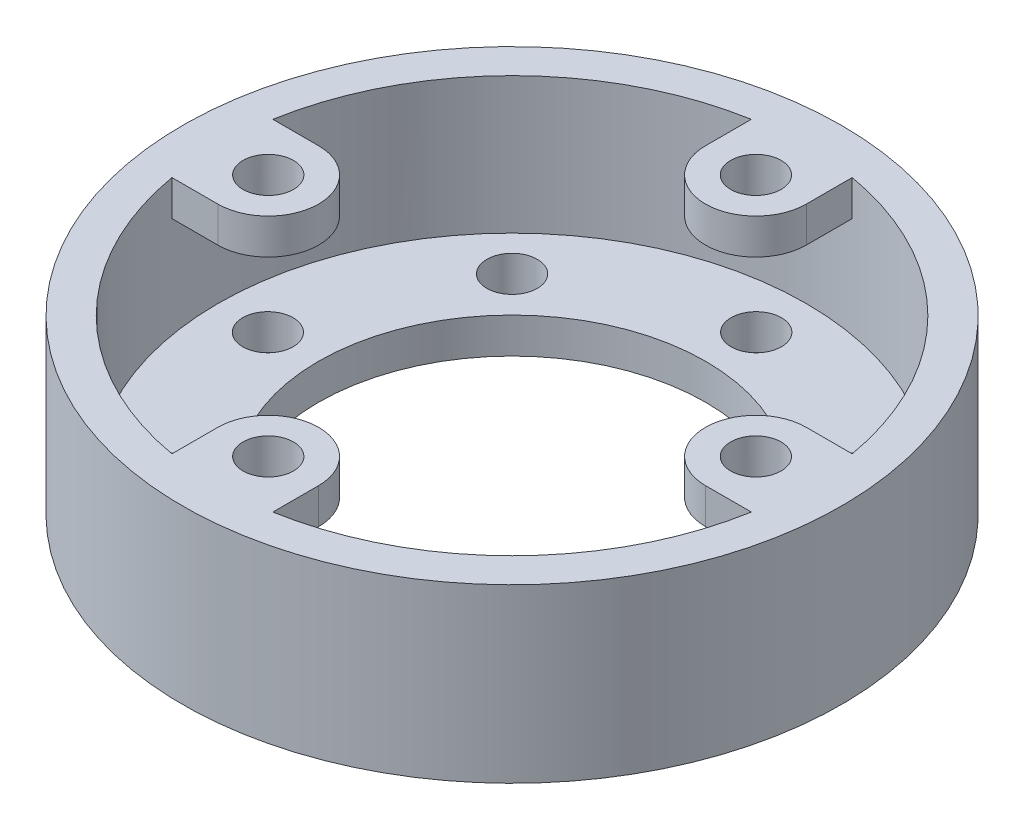
ISO-10303-21;
HEADER;
FILE_DESCRIPTION(('STEP AP214'),'2;1');
FILE_NAME('part.step','',(''),(''),'','','');
FILE_SCHEMA(('AUTOMOTIVE_DESIGN { 1 0 10303 214 1 1 1 1 }'));
ENDSEC;
DATA;
#1=APPLICATION_CONTEXT('core data for automotive mechanical design processes');
#2=APPLICATION_PROTOCOL_DEFINITION('international standard','automotive_design',2000,#1);
#3=PRODUCT_CONTEXT('',#1,'mechanical');
#4=PRODUCT('Part','Part','',(#3));
#5=PRODUCT_RELATED_PRODUCT_CATEGORY('part','',(#4));
#6=PRODUCT_DEFINITION_FORMATION('','',#4);
#7=PRODUCT_DEFINITION_CONTEXT('part definition',#1,'design');
#8=PRODUCT_DEFINITION('design','',#6,#7);
#9=PRODUCT_DEFINITION_SHAPE('','',#8);
#10=(LENGTH_UNIT() NAMED_UNIT(*) SI_UNIT(.MILLI.,.METRE.));
#11=(NAMED_UNIT(*) PLANE_ANGLE_UNIT() SI_UNIT($,.RADIAN.));
#12=(NAMED_UNIT(*) SI_UNIT($,.STERADIAN.) SOLID_ANGLE_UNIT());
#13=UNCERTAINTY_MEASURE_WITH_UNIT(LENGTH_MEASURE(1.E-05),#10,'distance_accuracy_value','');
#14=(GEOMETRIC_REPRESENTATION_CONTEXT(3) GLOBAL_UNCERTAINTY_ASSIGNED_CONTEXT((#13)) GLOBAL_UNIT_ASSIGNED_CONTEXT((#10,
#11,#12)) REPRESENTATION_CONTEXT('',''));
#15=CARTESIAN_POINT('',(0.,0.,0.));
#16=DIRECTION('',(0.,0.,1.));
#17=DIRECTION('',(1.,0.,0.));
#18=AXIS2_PLACEMENT_3D('',#15,#16,#17);
#19=CARTESIAN_POINT('',(0.,0.,0.));
#20=DIRECTION('',(0.,-1.,0.));
#21=DIRECTION('',(0.,0.,-1.));
#22=AXIS2_PLACEMENT_3D('',#19,#20,#21);
#23=CYLINDRICAL_SURFACE('',#22,2565.);
#24=CARTESIAN_POINT('',(0.,310.,0.));
#25=DIRECTION('',(0.,-1.,0.));
#26=DIRECTION('',(0.,0.,-1.));
#27=AXIS2_PLACEMENT_3D('',#24,#25,#26);
#28=CIRCLE('',#27,2565.);
#29=CARTESIAN_POINT('',(0.,310.,-2565.));
#30=VERTEX_POINT('',#29);
#31=EDGE_CURVE('E370',#30,#30,#28,.T.);
#32=ORIENTED_EDGE('',*,*,#31,.T.);
#33=EDGE_LOOP('',(#32));
#34=FACE_BOUND('',#33,.T.);
#35=DIRECTION('',(0.,1.,0.));
#36=VECTOR('',#35,1.);
#37=CARTESIAN_POINT('',(-2526.97942215602,1190.,-440.000000000026));
#38=LINE('',#37,#36);
#39=CARTESIAN_POINT('',(-2526.97942215602,1190.,-440.000000000026));
#40=VERTEX_POINT('',#39);
#41=CARTESIAN_POINT('',(-2526.97942215602,1500.,-440.000000000026));
#42=VERTEX_POINT('',#41);
#43=EDGE_CURVE('E55',#40,#42,#38,.T.);
#44=ORIENTED_EDGE('',*,*,#43,.F.);
#45=CARTESIAN_POINT('',(6.52811138479592E-11,1190.,0.));
#46=DIRECTION('',(0.,-1.,0.));
#47=DIRECTION('',(-1.,0.,0.));
#48=AXIS2_PLACEMENT_3D('',#45,#46,#47);
#49=CIRCLE('',#48,2565.00000000006);
#50=CARTESIAN_POINT('',(-2526.97942215603,1190.,439.999999999974));
#51=VERTEX_POINT('',#50);
#52=EDGE_CURVE('E162',#51,#40,#49,.T.);
#53=ORIENTED_EDGE('',*,*,#52,.F.);
#54=DIRECTION('',(0.,1.,0.));
#55=VECTOR('',#54,1.);
#56=CARTESIAN_POINT('',(-2526.97942215603,1190.,439.999999999974));
#57=LINE('',#56,#55);
#58=CARTESIAN_POINT('',(-2526.97942215603,1500.,439.999999999974));
#59=VERTEX_POINT('',#58);
#60=EDGE_CURVE('E782',#51,#59,#57,.T.);
#61=ORIENTED_EDGE('',*,*,#60,.T.);
#62=CARTESIAN_POINT('',(0.,1500.,0.));
#63=DIRECTION('',(0.,-1.,0.));
#64=DIRECTION('',(0.,0.,-1.));
#65=AXIS2_PLACEMENT_3D('',#62,#63,#64);
#66=CIRCLE('',#65,2565.);
#67=CARTESIAN_POINT('',(-440.,1500.,2526.97942215603));
#68=VERTEX_POINT('',#67);
#69=EDGE_CURVE('E468',#68,#59,#66,.T.);
#70=ORIENTED_EDGE('',*,*,#69,.F.);
#71=DIRECTION('',(0.,1.,0.));
#72=VECTOR('',#71,1.);
#73=CARTESIAN_POINT('',(-440.,1190.,2526.97942215603));
#74=LINE('',#73,#72);
#75=CARTESIAN_POINT('',(-440.,1190.,2526.97942215603));
#76=VERTEX_POINT('',#75);
#77=EDGE_CURVE('E63',#76,#68,#74,.T.);
#78=ORIENTED_EDGE('',*,*,#77,.F.);
#79=CARTESIAN_POINT('',(0.,1190.,-6.52811138479592E-11));
#80=DIRECTION('',(0.,-1.,0.));
#81=DIRECTION('',(0.,0.,1.));
#82=AXIS2_PLACEMENT_3D('',#79,#80,#81);
#83=CIRCLE('',#82,2565.00000000006);
#84=CARTESIAN_POINT('',(440.,1190.,2526.97942215603));
#85=VERTEX_POINT('',#84);
#86=EDGE_CURVE('E188',#85,#76,#83,.T.);
#87=ORIENTED_EDGE('',*,*,#86,.F.);
#88=DIRECTION('',(0.,1.,0.));
#89=VECTOR('',#88,1.);
#90=CARTESIAN_POINT('',(440.,1190.,2526.97942215603));
#91=LINE('',#90,#89);
#92=CARTESIAN_POINT('',(440.,1500.,2526.97942215603));
#93=VERTEX_POINT('',#92);
#94=EDGE_CURVE('E203',#85,#93,#91,.T.);
#95=ORIENTED_EDGE('',*,*,#94,.T.);
#96=CARTESIAN_POINT('',(2526.97942215602,1500.,440.000000000009));
#97=VERTEX_POINT('',#96);
#98=EDGE_CURVE('E382',#97,#93,#66,.T.);
#99=ORIENTED_EDGE('',*,*,#98,.F.);
#100=DIRECTION('',(0.,1.,0.));
#101=VECTOR('',#100,1.);
#102=CARTESIAN_POINT('',(2526.97942215602,1190.,440.000000000009));
#103=LINE('',#102,#101);
#104=CARTESIAN_POINT('',(2526.97942215602,1190.,440.000000000009));
#105=VERTEX_POINT('',#104);
#106=EDGE_CURVE('E259',#105,#97,#103,.T.);
#107=ORIENTED_EDGE('',*,*,#106,.F.);
#108=CARTESIAN_POINT('',(-6.52811138479592E-11,1190.,0.));
#109=DIRECTION('',(0.,-1.,0.));
#110=DIRECTION('',(1.,0.,0.));
#111=AXIS2_PLACEMENT_3D('',#108,#109,#110);
#112=CIRCLE('',#111,2565.00000000006);
#113=CARTESIAN_POINT('',(2526.97942215603,1190.,-439.999999999991));
#114=VERTEX_POINT('',#113);
#115=EDGE_CURVE('E223',#114,#105,#112,.T.);
#116=ORIENTED_EDGE('',*,*,#115,.F.);
#117=DIRECTION('',(0.,1.,0.));
#118=VECTOR('',#117,1.);
#119=CARTESIAN_POINT('',(2526.97942215603,1190.,-439.999999999991));
#120=LINE('',#119,#118);
#121=CARTESIAN_POINT('',(2526.97942215603,1500.,-439.999999999991));
#122=VERTEX_POINT('',#121);
#123=EDGE_CURVE('E239',#114,#122,#120,.T.);
#124=ORIENTED_EDGE('',*,*,#123,.T.);
#125=CARTESIAN_POINT('',(440.,1500.,-2526.97942215603));
#126=VERTEX_POINT('',#125);
#127=EDGE_CURVE('E377',#126,#122,#66,.T.);
#128=ORIENTED_EDGE('',*,*,#127,.F.);
#129=DIRECTION('',(0.,1.,0.));
#130=VECTOR('',#129,1.);
#131=CARTESIAN_POINT('',(440.,1190.,-2526.97942215603));
#132=LINE('',#131,#130);
#133=CARTESIAN_POINT('',(440.,1190.,-2526.97942215603));
#134=VERTEX_POINT('',#133);
#135=EDGE_CURVE('E306',#134,#126,#132,.T.);
#136=ORIENTED_EDGE('',*,*,#135,.F.);
#137=CARTESIAN_POINT('',(0.,1190.,6.52811138479592E-11));
#138=DIRECTION('',(0.,-1.,0.));
#139=DIRECTION('',(0.,0.,-1.));
#140=AXIS2_PLACEMENT_3D('',#137,#138,#139);
#141=CIRCLE('',#140,2565.00000000006);
#142=CARTESIAN_POINT('',(-440.,1190.,-2526.97942215603));
#143=VERTEX_POINT('',#142);
#144=EDGE_CURVE('E271',#143,#134,#141,.T.);
#145=ORIENTED_EDGE('',*,*,#144,.F.);
#146=DIRECTION('',(0.,1.,0.));
#147=VECTOR('',#146,1.);
#148=CARTESIAN_POINT('',(-440.,1190.,-2526.97942215603));
#149=LINE('',#148,#147);
#150=CARTESIAN_POINT('',(-440.,1500.,-2526.97942215603));
#151=VERTEX_POINT('',#150);
#152=EDGE_CURVE('E287',#143,#151,#149,.T.);
#153=ORIENTED_EDGE('',*,*,#152,.T.);
#154=EDGE_CURVE('E176',#42,#151,#66,.T.);
#155=ORIENTED_EDGE('',*,*,#154,.F.);
#156=EDGE_LOOP('',(#44,#53,#61,#70,#78,#87,#95,#99,#107,#116,#124,#128,#136,#145,#153,#155));
#157=FACE_BOUND('',#156,.T.);
#158=ADVANCED_FACE('F39',(#34,#157),#23,.F.);
#159=CARTESIAN_POINT('',(2565.,310.,0.));
#160=DIRECTION('',(0.,1.,0.));
#161=DIRECTION('',(0.,0.,1.));
#162=AXIS2_PLACEMENT_3D('',#159,#160,#161);
#163=PLANE('',#162);
#164=CARTESIAN_POINT('',(-7.43685525173587E-12,310.,-2130.));
#165=DIRECTION('',(0.,1.,0.));
#166=DIRECTION('',(1.,0.,0.));
#167=AXIS2_PLACEMENT_3D('',#164,#165,#166);
#168=CIRCLE('',#167,220.);
#169=CARTESIAN_POINT('',(219.999999999993,310.,-2130.));
#170=VERTEX_POINT('',#169);
#171=EDGE_CURVE('E331',#170,#170,#168,.T.);
#172=ORIENTED_EDGE('',*,*,#171,.F.);
#173=EDGE_LOOP('',(#172));
#174=FACE_BOUND('',#173,.T.);
#175=CARTESIAN_POINT('',(-1506.13744392735,310.,-1506.13744392734));
#176=DIRECTION('',(0.,1.,0.));
#177=DIRECTION('',(0.707106781186544,0.,-0.707106781186551));
#178=AXIS2_PLACEMENT_3D('',#175,#176,#177);
#179=CIRCLE('',#178,220.);
#180=CARTESIAN_POINT('',(-1350.57395206631,310.,-1661.70093578838));
#181=VERTEX_POINT('',#180);
#182=EDGE_CURVE('E339',#181,#181,#179,.T.);
#183=ORIENTED_EDGE('',*,*,#182,.F.);
#184=EDGE_LOOP('',(#183));
#185=FACE_BOUND('',#184,.T.);
#186=CARTESIAN_POINT('',(-2130.,310.,0.));
#187=DIRECTION('',(0.,1.,0.));
#188=DIRECTION('',(0.,0.,-1.));
#189=AXIS2_PLACEMENT_3D('',#186,#187,#188);
#190=CIRCLE('',#189,220.);
#191=CARTESIAN_POINT('',(-2130.,310.,-220.));
#192=VERTEX_POINT('',#191);
#193=EDGE_CURVE('E347',#192,#192,#190,.T.);
#194=ORIENTED_EDGE('',*,*,#193,.F.);
#195=EDGE_LOOP('',(#194));
#196=FACE_BOUND('',#195,.T.);
#197=CARTESIAN_POINT('',(-1506.13744392733,310.,1506.13744392736));
#198=DIRECTION('',(0.,1.,0.));
#199=DIRECTION('',(-0.707106781186554,0.,-0.707106781186541));
#200=AXIS2_PLACEMENT_3D('',#197,#198,#199);
#201=CIRCLE('',#200,220.);
#202=CARTESIAN_POINT('',(-1661.70093578837,310.,1350.57395206632));
#203=VERTEX_POINT('',#202);
#204=EDGE_CURVE('E314',#203,#203,#201,.T.);
#205=ORIENTED_EDGE('',*,*,#204,.F.);
#206=EDGE_LOOP('',(#205));
#207=FACE_BOUND('',#206,.T.);
#208=CARTESIAN_POINT('',(2.23105657552076E-11,310.,2130.));
#209=DIRECTION('',(0.,1.,0.));
#210=DIRECTION('',(-1.,0.,0.));
#211=AXIS2_PLACEMENT_3D('',#208,#209,#210);
#212=CIRCLE('',#211,220.);
#213=CARTESIAN_POINT('',(-219.999999999978,310.,2130.));
#214=VERTEX_POINT('',#213);
#215=EDGE_CURVE('E315',#214,#214,#212,.T.);
#216=ORIENTED_EDGE('',*,*,#215,.F.);
#217=EDGE_LOOP('',(#216));
#218=FACE_BOUND('',#217,.T.);
#219=CARTESIAN_POINT('',(1506.13744392736,310.,1506.13744392733));
#220=DIRECTION('',(0.,1.,0.));
#221=DIRECTION('',(-0.707106781186539,0.,0.707106781186556));
#222=AXIS2_PLACEMENT_3D('',#219,#220,#221);
#223=CIRCLE('',#222,220.);
#224=CARTESIAN_POINT('',(1350.57395206633,310.,1661.70093578837));
#225=VERTEX_POINT('',#224);
#226=EDGE_CURVE('E309',#225,#225,#223,.T.);
#227=ORIENTED_EDGE('',*,*,#226,.F.);
#228=EDGE_LOOP('',(#227));
#229=FACE_BOUND('',#228,.T.);
#230=CARTESIAN_POINT('',(1506.13744392734,310.,-1506.13744392735));
#231=DIRECTION('',(0.,1.,0.));
#232=DIRECTION('',(0.707106781186549,0.,0.707106781186546));
#233=AXIS2_PLACEMENT_3D('',#230,#231,#232);
#234=CIRCLE('',#233,220.);
#235=CARTESIAN_POINT('',(1661.70093578838,310.,-1350.57395206631));
#236=VERTEX_POINT('',#235);
#237=EDGE_CURVE('E330',#236,#236,#234,.T.);
#238=ORIENTED_EDGE('',*,*,#237,.F.);
#239=EDGE_LOOP('',(#238));
#240=FACE_BOUND('',#239,.T.);
#241=CARTESIAN_POINT('',(2130.,310.,0.));
#242=DIRECTION('',(0.,1.,0.));
#243=DIRECTION('',(0.,0.,1.));
#244=AXIS2_PLACEMENT_3D('',#241,#242,#243);
#245=CIRCLE('',#244,220.);
#246=CARTESIAN_POINT('',(2130.,310.,220.));
#247=VERTEX_POINT('',#246);
#248=EDGE_CURVE('E362',#247,#247,#245,.T.);
#249=ORIENTED_EDGE('',*,*,#248,.F.);
#250=EDGE_LOOP('',(#249));
#251=FACE_BOUND('',#250,.T.);
#252=CARTESIAN_POINT('',(0.,310.,0.));
#253=DIRECTION('',(0.,-1.,0.));
#254=DIRECTION('',(0.,0.,-1.));
#255=AXIS2_PLACEMENT_3D('',#252,#253,#254);
#256=CIRCLE('',#255,1690.);
#257=CARTESIAN_POINT('',(0.,310.,-1690.));
#258=VERTEX_POINT('',#257);
#259=EDGE_CURVE('E11',#258,#258,#256,.T.);
#260=ORIENTED_EDGE('',*,*,#259,.T.);
#261=EDGE_LOOP('',(#260));
#262=FACE_BOUND('',#261,.T.);
#263=ORIENTED_EDGE('',*,*,#31,.F.);
#264=EDGE_LOOP('',(#263));
#265=FACE_BOUND('',#264,.T.);
#266=ADVANCED_FACE('F41',(#174,#185,#196,#207,#218,#229,#240,#251,#262,#265),#163,.T.);
#267=CARTESIAN_POINT('',(0.,0.,0.));
#268=DIRECTION('',(0.,-1.,0.));
#269=DIRECTION('',(0.,0.,-1.));
#270=AXIS2_PLACEMENT_3D('',#267,#268,#269);
#271=CYLINDRICAL_SURFACE('',#270,1690.);
#272=CARTESIAN_POINT('',(0.,0.,0.));
#273=DIRECTION('',(0.,-1.,0.));
#274=DIRECTION('',(0.,0.,-1.));
#275=AXIS2_PLACEMENT_3D('',#272,#273,#274);
#276=CIRCLE('',#275,1690.);
#277=CARTESIAN_POINT('',(0.,0.,-1690.));
#278=VERTEX_POINT('',#277);
#279=EDGE_CURVE('E48',#278,#278,#276,.T.);
#280=ORIENTED_EDGE('',*,*,#279,.T.);
#281=EDGE_LOOP('',(#280));
#282=FACE_BOUND('',#281,.T.);
#283=ORIENTED_EDGE('',*,*,#259,.F.);
#284=EDGE_LOOP('',(#283));
#285=FACE_BOUND('',#284,.T.);
#286=ADVANCED_FACE('F393',(#282,#285),#271,.F.);
#287=CARTESIAN_POINT('',(1690.,0.,0.));
#288=DIRECTION('',(0.,-1.,0.));
#289=DIRECTION('',(0.,0.,-1.));
#290=AXIS2_PLACEMENT_3D('',#287,#288,#289);
#291=PLANE('',#290);
#292=CARTESIAN_POINT('',(-7.43685525173587E-12,0.,-2130.));
#293=DIRECTION('',(0.,1.,0.));
#294=DIRECTION('',(1.,0.,0.));
#295=AXIS2_PLACEMENT_3D('',#292,#293,#294);
#296=CIRCLE('',#295,220.);
#297=CARTESIAN_POINT('',(219.999999999993,0.,-2130.));
#298=VERTEX_POINT('',#297);
#299=EDGE_CURVE('E326',#298,#298,#296,.T.);
#300=ORIENTED_EDGE('',*,*,#299,.T.);
#301=EDGE_LOOP('',(#300));
#302=FACE_BOUND('',#301,.T.);
#303=CARTESIAN_POINT('',(-1506.13744392735,0.,-1506.13744392734));
#304=DIRECTION('',(0.,1.,0.));
#305=DIRECTION('',(0.707106781186544,0.,-0.707106781186551));
#306=AXIS2_PLACEMENT_3D('',#303,#304,#305);
#307=CIRCLE('',#306,220.);
#308=CARTESIAN_POINT('',(-1350.57395206631,0.,-1661.70093578838));
#309=VERTEX_POINT('',#308);
#310=EDGE_CURVE('E335',#309,#309,#307,.T.);
#311=ORIENTED_EDGE('',*,*,#310,.T.);
#312=EDGE_LOOP('',(#311));
#313=FACE_BOUND('',#312,.T.);
#314=CARTESIAN_POINT('',(-2130.,0.,0.));
#315=DIRECTION('',(0.,1.,0.));
#316=DIRECTION('',(0.,0.,-1.));
#317=AXIS2_PLACEMENT_3D('',#314,#315,#316);
#318=CIRCLE('',#317,220.);
#319=CARTESIAN_POINT('',(-2130.,0.,-220.));
#320=VERTEX_POINT('',#319);
#321=EDGE_CURVE('E343',#320,#320,#318,.T.);
#322=ORIENTED_EDGE('',*,*,#321,.T.);
#323=EDGE_LOOP('',(#322));
#324=FACE_BOUND('',#323,.T.);
#325=CARTESIAN_POINT('',(-1506.13744392733,0.,1506.13744392736));
#326=DIRECTION('',(0.,1.,0.));
#327=DIRECTION('',(-0.707106781186554,0.,-0.707106781186541));
#328=AXIS2_PLACEMENT_3D('',#325,#326,#327);
#329=CIRCLE('',#328,220.);
#330=CARTESIAN_POINT('',(-1661.70093578837,0.,1350.57395206632));
#331=VERTEX_POINT('',#330);
#332=EDGE_CURVE('E351',#331,#331,#329,.T.);
#333=ORIENTED_EDGE('',*,*,#332,.T.);
#334=EDGE_LOOP('',(#333));
#335=FACE_BOUND('',#334,.T.);
#336=CARTESIAN_POINT('',(2.23105657552076E-11,0.,2130.));
#337=DIRECTION('',(0.,1.,0.));
#338=DIRECTION('',(-1.,0.,0.));
#339=AXIS2_PLACEMENT_3D('',#336,#337,#338);
#340=CIRCLE('',#339,220.);
#341=CARTESIAN_POINT('',(-219.999999999978,0.,2130.));
#342=VERTEX_POINT('',#341);
#343=EDGE_CURVE('E310',#342,#342,#340,.T.);
#344=ORIENTED_EDGE('',*,*,#343,.T.);
#345=EDGE_LOOP('',(#344));
#346=FACE_BOUND('',#345,.T.);
#347=CARTESIAN_POINT('',(1506.13744392736,0.,1506.13744392733));
#348=DIRECTION('',(0.,1.,0.));
#349=DIRECTION('',(-0.707106781186539,0.,0.707106781186556));
#350=AXIS2_PLACEMENT_3D('',#347,#348,#349);
#351=CIRCLE('',#350,220.);
#352=CARTESIAN_POINT('',(1350.57395206633,0.,1661.70093578837));
#353=VERTEX_POINT('',#352);
#354=EDGE_CURVE('E319',#353,#353,#351,.T.);
#355=ORIENTED_EDGE('',*,*,#354,.T.);
#356=EDGE_LOOP('',(#355));
#357=FACE_BOUND('',#356,.T.);
#358=CARTESIAN_POINT('',(1506.13744392734,0.,-1506.13744392735));
#359=DIRECTION('',(0.,1.,0.));
#360=DIRECTION('',(0.707106781186549,0.,0.707106781186546));
#361=AXIS2_PLACEMENT_3D('',#358,#359,#360);
#362=CIRCLE('',#361,220.);
#363=CARTESIAN_POINT('',(1661.70093578838,0.,-1350.57395206631));
#364=VERTEX_POINT('',#363);
#365=EDGE_CURVE('E358',#364,#364,#362,.T.);
#366=ORIENTED_EDGE('',*,*,#365,.T.);
#367=EDGE_LOOP('',(#366));
#368=FACE_BOUND('',#367,.T.);
#369=CARTESIAN_POINT('',(2130.,0.,0.));
#370=DIRECTION('',(0.,1.,0.));
#371=DIRECTION('',(0.,0.,1.));
#372=AXIS2_PLACEMENT_3D('',#369,#370,#371);
#373=CIRCLE('',#372,220.);
#374=CARTESIAN_POINT('',(2130.,0.,220.));
#375=VERTEX_POINT('',#374);
#376=EDGE_CURVE('E366',#375,#375,#373,.T.);
#377=ORIENTED_EDGE('',*,*,#376,.T.);
#378=EDGE_LOOP('',(#377));
#379=FACE_BOUND('',#378,.T.);
#380=CARTESIAN_POINT('',(0.,0.,0.));
#381=DIRECTION('',(0.,-1.,0.));
#382=DIRECTION('',(0.,0.,-1.));
#383=AXIS2_PLACEMENT_3D('',#380,#381,#382);
#384=CIRCLE('',#383,2875.);
#385=CARTESIAN_POINT('',(0.,0.,-2875.));
#386=VERTEX_POINT('',#385);
#387=EDGE_CURVE('E386',#386,#386,#384,.T.);
#388=ORIENTED_EDGE('',*,*,#387,.T.);
#389=EDGE_LOOP('',(#388));
#390=FACE_BOUND('',#389,.T.);
#391=ORIENTED_EDGE('',*,*,#279,.F.);
#392=EDGE_LOOP('',(#391));
#393=FACE_BOUND('',#392,.T.);
#394=ADVANCED_FACE('F396',(#302,#313,#324,#335,#346,#357,#368,#379,#390,#393),#291,.T.);
#395=CARTESIAN_POINT('',(0.,0.,0.));
#396=DIRECTION('',(0.,-1.,0.));
#397=DIRECTION('',(0.,0.,-1.));
#398=AXIS2_PLACEMENT_3D('',#395,#396,#397);
#399=CYLINDRICAL_SURFACE('',#398,2875.);
#400=CARTESIAN_POINT('',(0.,1500.,0.));
#401=DIRECTION('',(0.,-1.,0.));
#402=DIRECTION('',(0.,0.,-1.));
#403=AXIS2_PLACEMENT_3D('',#400,#401,#402);
#404=CIRCLE('',#403,2875.);
#405=CARTESIAN_POINT('',(0.,1500.,-2875.));
#406=VERTEX_POINT('',#405);
#407=EDGE_CURVE('E381',#406,#406,#404,.T.);
#408=ORIENTED_EDGE('',*,*,#407,.T.);
#409=EDGE_LOOP('',(#408));
#410=FACE_BOUND('',#409,.T.);
#411=ORIENTED_EDGE('',*,*,#387,.F.);
#412=EDGE_LOOP('',(#411));
#413=FACE_BOUND('',#412,.T.);
#414=ADVANCED_FACE('F398',(#410,#413),#399,.T.);
#415=CARTESIAN_POINT('',(2875.,1500.,0.));
#416=DIRECTION('',(0.,1.,0.));
#417=DIRECTION('',(0.,0.,1.));
#418=AXIS2_PLACEMENT_3D('',#415,#416,#417);
#419=PLANE('',#418);
#420=CARTESIAN_POINT('',(2126.97942215603,1500.,7.25977550686734E-12));
#421=DIRECTION('',(0.,1.,0.));
#422=DIRECTION('',(-1.,0.,0.));
#423=AXIS2_PLACEMENT_3D('',#420,#421,#422);
#424=CIRCLE('',#423,220.);
#425=CARTESIAN_POINT('',(1906.97942215603,1500.,6.49164961232185E-12));
#426=VERTEX_POINT('',#425);
#427=EDGE_CURVE('E430',#426,#426,#424,.T.);
#428=ORIENTED_EDGE('',*,*,#427,.F.);
#429=EDGE_LOOP('',(#428));
#430=FACE_BOUND('',#429,.T.);
#431=CARTESIAN_POINT('',(1.66533453693773E-13,1500.,2126.97942215603));
#432=DIRECTION('',(0.,1.,0.));
#433=DIRECTION('',(0.,0.,-1.));
#434=AXIS2_PLACEMENT_3D('',#431,#432,#433);
#435=CIRCLE('',#434,220.);
#436=CARTESIAN_POINT('',(1.66533453693773E-13,1500.,1906.97942215603));
#437=VERTEX_POINT('',#436);
#438=EDGE_CURVE('E434',#437,#437,#435,.T.);
#439=ORIENTED_EDGE('',*,*,#438,.F.);
#440=EDGE_LOOP('',(#439));
#441=FACE_BOUND('',#440,.T.);
#442=CARTESIAN_POINT('',(-2126.97942215603,1500.,-2.21123934279896E-11));
#443=DIRECTION('',(0.,1.,0.));
#444=DIRECTION('',(1.,0.,0.));
#445=AXIS2_PLACEMENT_3D('',#442,#443,#444);
#446=CIRCLE('',#445,220.);
#447=CARTESIAN_POINT('',(-1906.97942215603,1500.,-1.98080157443531E-11));
#448=VERTEX_POINT('',#447);
#449=EDGE_CURVE('E438',#448,#448,#446,.T.);
#450=ORIENTED_EDGE('',*,*,#449,.F.);
#451=EDGE_LOOP('',(#450));
#452=FACE_BOUND('',#451,.T.);
#453=CARTESIAN_POINT('',(-1.66533453693773E-13,1500.,-2126.97942215603));
#454=DIRECTION('',(0.,1.,0.));
#455=DIRECTION('',(0.,0.,1.));
#456=AXIS2_PLACEMENT_3D('',#453,#454,#455);
#457=CIRCLE('',#456,220.);
#458=CARTESIAN_POINT('',(-1.66533453693773E-13,1500.,-1906.97942215603));
#459=VERTEX_POINT('',#458);
#460=EDGE_CURVE('E263',#459,#459,#457,.T.);
#461=ORIENTED_EDGE('',*,*,#460,.F.);
#462=EDGE_LOOP('',(#461));
#463=FACE_BOUND('',#462,.T.);
#464=ORIENTED_EDGE('',*,*,#127,.T.);
#465=DIRECTION('',(-1.,0.,0.));
#466=VECTOR('',#465,1.);
#467=CARTESIAN_POINT('',(2526.97942215603,1500.,-439.999999999991));
#468=LINE('',#467,#466);
#469=CARTESIAN_POINT('',(2126.97942215603,1500.,-439.999999999993));
#470=VERTEX_POINT('',#469);
#471=EDGE_CURVE('E228',#122,#470,#468,.T.);
#472=ORIENTED_EDGE('',*,*,#471,.T.);
#473=CARTESIAN_POINT('',(2126.97942215603,1500.,7.17650878002045E-12));
#474=DIRECTION('',(0.,1.,0.));
#475=DIRECTION('',(-1.,0.,0.));
#476=AXIS2_PLACEMENT_3D('',#473,#474,#475);
#477=CIRCLE('',#476,440.);
#478=CARTESIAN_POINT('',(2126.97942215602,1500.,440.000000000007));
#479=VERTEX_POINT('',#478);
#480=EDGE_CURVE('E243',#470,#479,#477,.T.);
#481=ORIENTED_EDGE('',*,*,#480,.T.);
#482=DIRECTION('',(-1.,0.,0.));
#483=VECTOR('',#482,1.);
#484=CARTESIAN_POINT('',(2526.97942215602,1500.,440.000000000009));
#485=LINE('',#484,#483);
#486=EDGE_CURVE('E222',#97,#479,#485,.T.);
#487=ORIENTED_EDGE('',*,*,#486,.F.);
#488=ORIENTED_EDGE('',*,*,#98,.T.);
#489=DIRECTION('',(0.,0.,-1.));
#490=VECTOR('',#489,1.);
#491=CARTESIAN_POINT('',(440.,1500.,2526.97942215603));
#492=LINE('',#491,#490);
#493=CARTESIAN_POINT('',(440.,1500.,2126.97942215603));
#494=VERTEX_POINT('',#493);
#495=EDGE_CURVE('E193',#93,#494,#492,.T.);
#496=ORIENTED_EDGE('',*,*,#495,.T.);
#497=CARTESIAN_POINT('',(2.4980018054066E-13,1500.,2126.97942215603));
#498=DIRECTION('',(0.,1.,0.));
#499=DIRECTION('',(0.,0.,-1.));
#500=AXIS2_PLACEMENT_3D('',#497,#498,#499);
#501=CIRCLE('',#500,440.);
#502=CARTESIAN_POINT('',(-440.,1500.,2126.97942215603));
#503=VERTEX_POINT('',#502);
#504=EDGE_CURVE('E182',#494,#503,#501,.T.);
#505=ORIENTED_EDGE('',*,*,#504,.T.);
#506=DIRECTION('',(0.,0.,-1.));
#507=VECTOR('',#506,1.);
#508=CARTESIAN_POINT('',(-440.,1500.,2526.97942215603));
#509=LINE('',#508,#507);
#510=EDGE_CURVE('E178',#68,#503,#509,.T.);
#511=ORIENTED_EDGE('',*,*,#510,.F.);
#512=ORIENTED_EDGE('',*,*,#69,.T.);
#513=DIRECTION('',(1.,0.,0.));
#514=VECTOR('',#513,1.);
#515=CARTESIAN_POINT('',(-2526.97942215603,1500.,439.999999999974));
#516=LINE('',#515,#514);
#517=CARTESIAN_POINT('',(-2126.97942215603,1500.,439.999999999978));
#518=VERTEX_POINT('',#517);
#519=EDGE_CURVE('E172',#59,#518,#516,.T.);
#520=ORIENTED_EDGE('',*,*,#519,.T.);
#521=CARTESIAN_POINT('',(-2126.97942215603,1500.,-2.20291267011427E-11));
#522=DIRECTION('',(0.,1.,0.));
#523=DIRECTION('',(1.,0.,0.));
#524=AXIS2_PLACEMENT_3D('',#521,#522,#523);
#525=CIRCLE('',#524,440.);
#526=CARTESIAN_POINT('',(-2126.97942215602,1500.,-440.000000000022));
#527=VERTEX_POINT('',#526);
#528=EDGE_CURVE('E763',#518,#527,#525,.T.);
#529=ORIENTED_EDGE('',*,*,#528,.T.);
#530=DIRECTION('',(1.,0.,0.));
#531=VECTOR('',#530,1.);
#532=CARTESIAN_POINT('',(-2526.97942215602,1500.,-440.000000000026));
#533=LINE('',#532,#531);
#534=EDGE_CURVE('E476',#42,#527,#533,.T.);
#535=ORIENTED_EDGE('',*,*,#534,.F.);
#536=ORIENTED_EDGE('',*,*,#154,.T.);
#537=DIRECTION('',(0.,0.,1.));
#538=VECTOR('',#537,1.);
#539=CARTESIAN_POINT('',(-440.,1500.,-2526.97942215603));
#540=LINE('',#539,#538);
#541=CARTESIAN_POINT('',(-440.,1500.,-2126.97942215603));
#542=VERTEX_POINT('',#541);
#543=EDGE_CURVE('E276',#151,#542,#540,.T.);
#544=ORIENTED_EDGE('',*,*,#543,.T.);
#545=CARTESIAN_POINT('',(-2.4980018054066E-13,1500.,-2126.97942215603));
#546=DIRECTION('',(0.,1.,0.));
#547=DIRECTION('',(0.,0.,1.));
#548=AXIS2_PLACEMENT_3D('',#545,#546,#547);
#549=CIRCLE('',#548,440.);
#550=CARTESIAN_POINT('',(440.,1500.,-2126.97942215603));
#551=VERTEX_POINT('',#550);
#552=EDGE_CURVE('E291',#542,#551,#549,.T.);
#553=ORIENTED_EDGE('',*,*,#552,.T.);
#554=DIRECTION('',(0.,0.,1.));
#555=VECTOR('',#554,1.);
#556=CARTESIAN_POINT('',(440.,1500.,-2526.97942215603));
#557=LINE('',#556,#555);
#558=EDGE_CURVE('E267',#126,#551,#557,.T.);
#559=ORIENTED_EDGE('',*,*,#558,.F.);
#560=EDGE_LOOP('',(#464,#472,#481,#487,#488,#496,#505,#511,#512,#520,#529,#535,#536,#544,#553,#559));
#561=FACE_BOUND('',#560,.T.);
#562=ORIENTED_EDGE('',*,*,#407,.F.);
#563=EDGE_LOOP('',(#562));
#564=FACE_BOUND('',#563,.T.);
#565=ADVANCED_FACE('F405',(#430,#441,#452,#463,#561,#564),#419,.T.);
#566=CARTESIAN_POINT('',(2130.,0.,0.));
#567=DIRECTION('',(0.,1.,0.));
#568=DIRECTION('',(0.,0.,1.));
#569=AXIS2_PLACEMENT_3D('',#566,#567,#568);
#570=CYLINDRICAL_SURFACE('',#569,220.);
#571=ORIENTED_EDGE('',*,*,#376,.F.);
#572=EDGE_LOOP('',(#571));
#573=FACE_BOUND('',#572,.T.);
#574=ORIENTED_EDGE('',*,*,#248,.T.);
#575=EDGE_LOOP('',(#574));
#576=FACE_BOUND('',#575,.T.);
#577=ADVANCED_FACE('F418',(#573,#576),#570,.F.);
#578=CARTESIAN_POINT('',(1506.13744392734,0.,-1506.13744392735));
#579=DIRECTION('',(0.,1.,0.));
#580=DIRECTION('',(0.,0.,1.));
#581=AXIS2_PLACEMENT_3D('',#578,#579,#580);
#582=CYLINDRICAL_SURFACE('',#581,220.);
#583=ORIENTED_EDGE('',*,*,#365,.F.);
#584=EDGE_LOOP('',(#583));
#585=FACE_BOUND('',#584,.T.);
#586=ORIENTED_EDGE('',*,*,#237,.T.);
#587=EDGE_LOOP('',(#586));
#588=FACE_BOUND('',#587,.T.);
#589=ADVANCED_FACE('F425',(#585,#588),#582,.F.);
#590=CARTESIAN_POINT('',(1506.13744392736,0.,1506.13744392733));
#591=DIRECTION('',(0.,1.,0.));
#592=DIRECTION('',(0.,0.,1.));
#593=AXIS2_PLACEMENT_3D('',#590,#591,#592);
#594=CYLINDRICAL_SURFACE('',#593,220.);
#595=ORIENTED_EDGE('',*,*,#354,.F.);
#596=EDGE_LOOP('',(#595));
#597=FACE_BOUND('',#596,.T.);
#598=ORIENTED_EDGE('',*,*,#226,.T.);
#599=EDGE_LOOP('',(#598));
#600=FACE_BOUND('',#599,.T.);
#601=ADVANCED_FACE('F506',(#597,#600),#594,.F.);
#602=CARTESIAN_POINT('',(2.23105657552076E-11,0.,2130.));
#603=DIRECTION('',(0.,1.,0.));
#604=DIRECTION('',(0.,0.,1.));
#605=AXIS2_PLACEMENT_3D('',#602,#603,#604);
#606=CYLINDRICAL_SURFACE('',#605,220.);
#607=ORIENTED_EDGE('',*,*,#343,.F.);
#608=EDGE_LOOP('',(#607));
#609=FACE_BOUND('',#608,.T.);
#610=ORIENTED_EDGE('',*,*,#215,.T.);
#611=EDGE_LOOP('',(#610));
#612=FACE_BOUND('',#611,.T.);
#613=ADVANCED_FACE('F502',(#609,#612),#606,.F.);
#614=CARTESIAN_POINT('',(-1506.13744392733,0.,1506.13744392736));
#615=DIRECTION('',(0.,1.,0.));
#616=DIRECTION('',(0.,0.,1.));
#617=AXIS2_PLACEMENT_3D('',#614,#615,#616);
#618=CYLINDRICAL_SURFACE('',#617,220.);
#619=ORIENTED_EDGE('',*,*,#332,.F.);
#620=EDGE_LOOP('',(#619));
#621=FACE_BOUND('',#620,.T.);
#622=ORIENTED_EDGE('',*,*,#204,.T.);
#623=EDGE_LOOP('',(#622));
#624=FACE_BOUND('',#623,.T.);
#625=ADVANCED_FACE('F505',(#621,#624),#618,.F.);
#626=CARTESIAN_POINT('',(-2130.,0.,0.));
#627=DIRECTION('',(0.,1.,0.));
#628=DIRECTION('',(0.,0.,1.));
#629=AXIS2_PLACEMENT_3D('',#626,#627,#628);
#630=CYLINDRICAL_SURFACE('',#629,220.);
#631=ORIENTED_EDGE('',*,*,#321,.F.);
#632=EDGE_LOOP('',(#631));
#633=FACE_BOUND('',#632,.T.);
#634=ORIENTED_EDGE('',*,*,#193,.T.);
#635=EDGE_LOOP('',(#634));
#636=FACE_BOUND('',#635,.T.);
#637=ADVANCED_FACE('F513',(#633,#636),#630,.F.);
#638=CARTESIAN_POINT('',(-1506.13744392735,0.,-1506.13744392734));
#639=DIRECTION('',(0.,1.,0.));
#640=DIRECTION('',(0.,0.,1.));
#641=AXIS2_PLACEMENT_3D('',#638,#639,#640);
#642=CYLINDRICAL_SURFACE('',#641,220.);
#643=ORIENTED_EDGE('',*,*,#310,.F.);
#644=EDGE_LOOP('',(#643));
#645=FACE_BOUND('',#644,.T.);
#646=ORIENTED_EDGE('',*,*,#182,.T.);
#647=EDGE_LOOP('',(#646));
#648=FACE_BOUND('',#647,.T.);
#649=ADVANCED_FACE('F497',(#645,#648),#642,.F.);
#650=CARTESIAN_POINT('',(-7.43685525173587E-12,0.,-2130.));
#651=DIRECTION('',(0.,1.,0.));
#652=DIRECTION('',(0.,0.,1.));
#653=AXIS2_PLACEMENT_3D('',#650,#651,#652);
#654=CYLINDRICAL_SURFACE('',#653,220.);
#655=ORIENTED_EDGE('',*,*,#299,.F.);
#656=EDGE_LOOP('',(#655));
#657=FACE_BOUND('',#656,.T.);
#658=ORIENTED_EDGE('',*,*,#171,.T.);
#659=EDGE_LOOP('',(#658));
#660=FACE_BOUND('',#659,.T.);
#661=ADVANCED_FACE('F490',(#657,#660),#654,.F.);
#662=CARTESIAN_POINT('',(440.,1190.,-2526.97942215603));
#663=DIRECTION('',(-1.,0.,0.));
#664=DIRECTION('',(0.,0.,1.));
#665=AXIS2_PLACEMENT_3D('',#662,#663,#664);
#666=PLANE('',#665);
#667=ORIENTED_EDGE('',*,*,#558,.T.);
#668=DIRECTION('',(0.,1.,0.));
#669=VECTOR('',#668,1.);
#670=CARTESIAN_POINT('',(440.,1190.,-2126.97942215603));
#671=LINE('',#670,#669);
#672=CARTESIAN_POINT('',(440.,1190.,-2126.97942215603));
#673=VERTEX_POINT('',#672);
#674=EDGE_CURVE('E303',#673,#551,#671,.T.);
#675=ORIENTED_EDGE('',*,*,#674,.F.);
#676=DIRECTION('',(0.,0.,1.));
#677=VECTOR('',#676,1.);
#678=CARTESIAN_POINT('',(440.,1190.,-2526.97942215603));
#679=LINE('',#678,#677);
#680=EDGE_CURVE('E275',#134,#673,#679,.T.);
#681=ORIENTED_EDGE('',*,*,#680,.F.);
#682=ORIENTED_EDGE('',*,*,#135,.T.);
#683=EDGE_LOOP('',(#667,#675,#681,#682));
#684=FACE_BOUND('',#683,.T.);
#685=ADVANCED_FACE('F488',(#684),#666,.F.);
#686=CARTESIAN_POINT('',(-2.4980018054066E-13,1190.,-2126.97942215603));
#687=DIRECTION('',(0.,1.,0.));
#688=DIRECTION('',(0.,0.,1.));
#689=AXIS2_PLACEMENT_3D('',#686,#687,#688);
#690=CYLINDRICAL_SURFACE('',#689,440.);
#691=ORIENTED_EDGE('',*,*,#552,.F.);
#692=DIRECTION('',(0.,1.,0.));
#693=VECTOR('',#692,1.);
#694=CARTESIAN_POINT('',(-440.,1190.,-2126.97942215603));
#695=LINE('',#694,#693);
#696=CARTESIAN_POINT('',(-440.,1190.,-2126.97942215603));
#697=VERTEX_POINT('',#696);
#698=EDGE_CURVE('E300',#697,#542,#695,.T.);
#699=ORIENTED_EDGE('',*,*,#698,.F.);
#700=CARTESIAN_POINT('',(-2.4980018054066E-13,1190.,-2126.97942215603));
#701=DIRECTION('',(0.,1.,0.));
#702=DIRECTION('',(0.,0.,1.));
#703=AXIS2_PLACEMENT_3D('',#700,#701,#702);
#704=CIRCLE('',#703,440.);
#705=EDGE_CURVE('E279',#697,#673,#704,.T.);
#706=ORIENTED_EDGE('',*,*,#705,.T.);
#707=ORIENTED_EDGE('',*,*,#674,.T.);
#708=EDGE_LOOP('',(#691,#699,#706,#707));
#709=FACE_BOUND('',#708,.T.);
#710=ADVANCED_FACE('F486',(#709),#690,.T.);
#711=CARTESIAN_POINT('',(-440.,1190.,-2526.97942215603));
#712=DIRECTION('',(-1.,0.,0.));
#713=DIRECTION('',(0.,0.,1.));
#714=AXIS2_PLACEMENT_3D('',#711,#712,#713);
#715=PLANE('',#714);
#716=ORIENTED_EDGE('',*,*,#543,.F.);
#717=ORIENTED_EDGE('',*,*,#152,.F.);
#718=DIRECTION('',(0.,0.,1.));
#719=VECTOR('',#718,1.);
#720=CARTESIAN_POINT('',(-440.,1190.,-2526.97942215603));
#721=LINE('',#720,#719);
#722=EDGE_CURVE('E283',#143,#697,#721,.T.);
#723=ORIENTED_EDGE('',*,*,#722,.T.);
#724=ORIENTED_EDGE('',*,*,#698,.T.);
#725=EDGE_LOOP('',(#716,#717,#723,#724));
#726=FACE_BOUND('',#725,.T.);
#727=ADVANCED_FACE('F478',(#726),#715,.T.);
#728=CARTESIAN_POINT('',(0.,1190.,6.52811138479592E-11));
#729=DIRECTION('',(0.,-1.,0.));
#730=DIRECTION('',(0.,0.,-1.));
#731=AXIS2_PLACEMENT_3D('',#728,#729,#730);
#732=PLANE('',#731);
#733=CARTESIAN_POINT('',(-1.66533453693773E-13,1190.,-2126.97942215603));
#734=DIRECTION('',(0.,-1.,0.));
#735=DIRECTION('',(0.,0.,-1.));
#736=AXIS2_PLACEMENT_3D('',#733,#734,#735);
#737=CIRCLE('',#736,220.);
#738=CARTESIAN_POINT('',(-1.66533453693773E-13,1190.,-2346.97942215603));
#739=VERTEX_POINT('',#738);
#740=EDGE_CURVE('E262',#739,#739,#737,.F.);
#741=ORIENTED_EDGE('',*,*,#740,.T.);
#742=EDGE_LOOP('',(#741));
#743=FACE_BOUND('',#742,.T.);
#744=ORIENTED_EDGE('',*,*,#144,.T.);
#745=ORIENTED_EDGE('',*,*,#680,.T.);
#746=ORIENTED_EDGE('',*,*,#705,.F.);
#747=ORIENTED_EDGE('',*,*,#722,.F.);
#748=EDGE_LOOP('',(#744,#745,#746,#747));
#749=FACE_BOUND('',#748,.T.);
#750=ADVANCED_FACE('F482',(#743,#749),#732,.T.);
#751=CARTESIAN_POINT('',(-1.66533453693773E-13,-0.000999999999917733,-2126.97942215603));
#752=DIRECTION('',(0.,1.,0.));
#753=DIRECTION('',(0.,0.,1.));
#754=AXIS2_PLACEMENT_3D('',#751,#752,#753);
#755=CYLINDRICAL_SURFACE('',#754,220.);
#756=ORIENTED_EDGE('',*,*,#740,.F.);
#757=EDGE_LOOP('',(#756));
#758=FACE_BOUND('',#757,.T.);
#759=ORIENTED_EDGE('',*,*,#460,.T.);
#760=EDGE_LOOP('',(#759));
#761=FACE_BOUND('',#760,.T.);
#762=ADVANCED_FACE('F591',(#758,#761),#755,.F.);
#763=CARTESIAN_POINT('',(2526.97942215602,1190.,440.000000000009));
#764=DIRECTION('',(0.,0.,-1.));
#765=DIRECTION('',(-1.,0.,0.));
#766=AXIS2_PLACEMENT_3D('',#763,#764,#765);
#767=PLANE('',#766);
#768=ORIENTED_EDGE('',*,*,#486,.T.);
#769=DIRECTION('',(0.,1.,0.));
#770=VECTOR('',#769,1.);
#771=CARTESIAN_POINT('',(2126.97942215602,1190.,440.000000000007));
#772=LINE('',#771,#770);
#773=CARTESIAN_POINT('',(2126.97942215602,1190.,440.000000000007));
#774=VERTEX_POINT('',#773);
#775=EDGE_CURVE('E256',#774,#479,#772,.T.);
#776=ORIENTED_EDGE('',*,*,#775,.F.);
#777=DIRECTION('',(-1.,0.,0.));
#778=VECTOR('',#777,1.);
#779=CARTESIAN_POINT('',(2526.97942215602,1190.,440.000000000009));
#780=LINE('',#779,#778);
#781=EDGE_CURVE('E227',#105,#774,#780,.T.);
#782=ORIENTED_EDGE('',*,*,#781,.F.);
#783=ORIENTED_EDGE('',*,*,#106,.T.);
#784=EDGE_LOOP('',(#768,#776,#782,#783));
#785=FACE_BOUND('',#784,.T.);
#786=ADVANCED_FACE('F600',(#785),#767,.F.);
#787=CARTESIAN_POINT('',(2126.97942215603,1190.,7.17650878002045E-12));
#788=DIRECTION('',(0.,1.,0.));
#789=DIRECTION('',(0.,0.,1.));
#790=AXIS2_PLACEMENT_3D('',#787,#788,#789);
#791=CYLINDRICAL_SURFACE('',#790,440.);
#792=ORIENTED_EDGE('',*,*,#480,.F.);
#793=DIRECTION('',(0.,1.,0.));
#794=VECTOR('',#793,1.);
#795=CARTESIAN_POINT('',(2126.97942215603,1190.,-439.999999999993));
#796=LINE('',#795,#794);
#797=CARTESIAN_POINT('',(2126.97942215603,1190.,-439.999999999993));
#798=VERTEX_POINT('',#797);
#799=EDGE_CURVE('E253',#798,#470,#796,.T.);
#800=ORIENTED_EDGE('',*,*,#799,.F.);
#801=CARTESIAN_POINT('',(2126.97942215603,1190.,7.17650878002045E-12));
#802=DIRECTION('',(0.,1.,0.));
#803=DIRECTION('',(-1.,0.,0.));
#804=AXIS2_PLACEMENT_3D('',#801,#802,#803);
#805=CIRCLE('',#804,440.);
#806=EDGE_CURVE('E231',#798,#774,#805,.T.);
#807=ORIENTED_EDGE('',*,*,#806,.T.);
#808=ORIENTED_EDGE('',*,*,#775,.T.);
#809=EDGE_LOOP('',(#792,#800,#807,#808));
#810=FACE_BOUND('',#809,.T.);
#811=ADVANCED_FACE('F461',(#810),#791,.T.);
#812=CARTESIAN_POINT('',(2526.97942215603,1190.,-439.999999999991));
#813=DIRECTION('',(0.,0.,-1.));
#814=DIRECTION('',(-1.,0.,0.));
#815=AXIS2_PLACEMENT_3D('',#812,#813,#814);
#816=PLANE('',#815);
#817=ORIENTED_EDGE('',*,*,#471,.F.);
#818=ORIENTED_EDGE('',*,*,#123,.F.);
#819=DIRECTION('',(-1.,0.,0.));
#820=VECTOR('',#819,1.);
#821=CARTESIAN_POINT('',(2526.97942215603,1190.,-439.999999999991));
#822=LINE('',#821,#820);
#823=EDGE_CURVE('E235',#114,#798,#822,.T.);
#824=ORIENTED_EDGE('',*,*,#823,.T.);
#825=ORIENTED_EDGE('',*,*,#799,.T.);
#826=EDGE_LOOP('',(#817,#818,#824,#825));
#827=FACE_BOUND('',#826,.T.);
#828=ADVANCED_FACE('F454',(#827),#816,.T.);
#829=CARTESIAN_POINT('',(-6.52811138479592E-11,1190.,0.));
#830=DIRECTION('',(0.,-1.,0.));
#831=DIRECTION('',(1.,0.,0.));
#832=AXIS2_PLACEMENT_3D('',#829,#830,#831);
#833=PLANE('',#832);
#834=CARTESIAN_POINT('',(2126.97942215603,1190.,7.25977550686734E-12));
#835=DIRECTION('',(0.,-1.,0.));
#836=DIRECTION('',(0.,0.,-1.));
#837=AXIS2_PLACEMENT_3D('',#834,#835,#836);
#838=CIRCLE('',#837,220.);
#839=CARTESIAN_POINT('',(2126.97942215603,1190.,-219.999999999993));
#840=VERTEX_POINT('',#839);
#841=EDGE_CURVE('E758',#840,#840,#838,.F.);
#842=ORIENTED_EDGE('',*,*,#841,.T.);
#843=EDGE_LOOP('',(#842));
#844=FACE_BOUND('',#843,.T.);
#845=ORIENTED_EDGE('',*,*,#115,.T.);
#846=ORIENTED_EDGE('',*,*,#781,.T.);
#847=ORIENTED_EDGE('',*,*,#806,.F.);
#848=ORIENTED_EDGE('',*,*,#823,.F.);
#849=EDGE_LOOP('',(#845,#846,#847,#848));
#850=FACE_BOUND('',#849,.T.);
#851=ADVANCED_FACE('F457',(#844,#850),#833,.T.);
#852=CARTESIAN_POINT('',(-440.,1190.,2526.97942215603));
#853=DIRECTION('',(1.,0.,0.));
#854=DIRECTION('',(0.,0.,-1.));
#855=AXIS2_PLACEMENT_3D('',#852,#853,#854);
#856=PLANE('',#855);
#857=ORIENTED_EDGE('',*,*,#510,.T.);
#858=DIRECTION('',(0.,1.,0.));
#859=VECTOR('',#858,1.);
#860=CARTESIAN_POINT('',(-440.,1190.,2126.97942215603));
#861=LINE('',#860,#859);
#862=CARTESIAN_POINT('',(-440.,1190.,2126.97942215603));
#863=VERTEX_POINT('',#862);
#864=EDGE_CURVE('E217',#863,#503,#861,.T.);
#865=ORIENTED_EDGE('',*,*,#864,.F.);
#866=DIRECTION('',(0.,0.,-1.));
#867=VECTOR('',#866,1.);
#868=CARTESIAN_POINT('',(-440.,1190.,2526.97942215603));
#869=LINE('',#868,#867);
#870=EDGE_CURVE('E192',#76,#863,#869,.T.);
#871=ORIENTED_EDGE('',*,*,#870,.F.);
#872=ORIENTED_EDGE('',*,*,#77,.T.);
#873=EDGE_LOOP('',(#857,#865,#871,#872));
#874=FACE_BOUND('',#873,.T.);
#875=ADVANCED_FACE('F645',(#874),#856,.F.);
#876=CARTESIAN_POINT('',(2.4980018054066E-13,1190.,2126.97942215603));
#877=DIRECTION('',(0.,1.,0.));
#878=DIRECTION('',(0.,0.,1.));
#879=AXIS2_PLACEMENT_3D('',#876,#877,#878);
#880=CYLINDRICAL_SURFACE('',#879,440.);
#881=ORIENTED_EDGE('',*,*,#504,.F.);
#882=DIRECTION('',(0.,1.,0.));
#883=VECTOR('',#882,1.);
#884=CARTESIAN_POINT('',(440.,1190.,2126.97942215603));
#885=LINE('',#884,#883);
#886=CARTESIAN_POINT('',(440.,1190.,2126.97942215603));
#887=VERTEX_POINT('',#886);
#888=EDGE_CURVE('E214',#887,#494,#885,.T.);
#889=ORIENTED_EDGE('',*,*,#888,.F.);
#890=CARTESIAN_POINT('',(2.4980018054066E-13,1190.,2126.97942215603));
#891=DIRECTION('',(0.,1.,0.));
#892=DIRECTION('',(0.,0.,-1.));
#893=AXIS2_PLACEMENT_3D('',#890,#891,#892);
#894=CIRCLE('',#893,440.);
#895=EDGE_CURVE('E196',#887,#863,#894,.T.);
#896=ORIENTED_EDGE('',*,*,#895,.T.);
#897=ORIENTED_EDGE('',*,*,#864,.T.);
#898=EDGE_LOOP('',(#881,#889,#896,#897));
#899=FACE_BOUND('',#898,.T.);
#900=ADVANCED_FACE('F655',(#899),#880,.T.);
#901=CARTESIAN_POINT('',(440.,1190.,2526.97942215603));
#902=DIRECTION('',(1.,0.,0.));
#903=DIRECTION('',(0.,0.,-1.));
#904=AXIS2_PLACEMENT_3D('',#901,#902,#903);
#905=PLANE('',#904);
#906=ORIENTED_EDGE('',*,*,#495,.F.);
#907=ORIENTED_EDGE('',*,*,#94,.F.);
#908=DIRECTION('',(0.,0.,-1.));
#909=VECTOR('',#908,1.);
#910=CARTESIAN_POINT('',(440.,1190.,2526.97942215603));
#911=LINE('',#910,#909);
#912=EDGE_CURVE('E200',#85,#887,#911,.T.);
#913=ORIENTED_EDGE('',*,*,#912,.T.);
#914=ORIENTED_EDGE('',*,*,#888,.T.);
#915=EDGE_LOOP('',(#906,#907,#913,#914));
#916=FACE_BOUND('',#915,.T.);
#917=ADVANCED_FACE('F664',(#916),#905,.T.);
#918=CARTESIAN_POINT('',(0.,1190.,-6.52811138479592E-11));
#919=DIRECTION('',(0.,-1.,0.));
#920=DIRECTION('',(0.,0.,1.));
#921=AXIS2_PLACEMENT_3D('',#918,#919,#920);
#922=PLANE('',#921);
#923=CARTESIAN_POINT('',(1.66533453693773E-13,1190.,2126.97942215603));
#924=DIRECTION('',(0.,-1.,0.));
#925=DIRECTION('',(0.,0.,-1.));
#926=AXIS2_PLACEMENT_3D('',#923,#924,#925);
#927=CIRCLE('',#926,220.);
#928=CARTESIAN_POINT('',(1.66533453693773E-13,1190.,1906.97942215603));
#929=VERTEX_POINT('',#928);
#930=EDGE_CURVE('E769',#929,#929,#927,.F.);
#931=ORIENTED_EDGE('',*,*,#930,.T.);
#932=EDGE_LOOP('',(#931));
#933=FACE_BOUND('',#932,.T.);
#934=ORIENTED_EDGE('',*,*,#86,.T.);
#935=ORIENTED_EDGE('',*,*,#870,.T.);
#936=ORIENTED_EDGE('',*,*,#895,.F.);
#937=ORIENTED_EDGE('',*,*,#912,.F.);
#938=EDGE_LOOP('',(#934,#935,#936,#937));
#939=FACE_BOUND('',#938,.T.);
#940=ADVANCED_FACE('F674',(#933,#939),#922,.T.);
#941=CARTESIAN_POINT('',(-2526.97942215602,1190.,-440.000000000026));
#942=DIRECTION('',(0.,0.,1.));
#943=DIRECTION('',(1.,0.,0.));
#944=AXIS2_PLACEMENT_3D('',#941,#942,#943);
#945=PLANE('',#944);
#946=ORIENTED_EDGE('',*,*,#534,.T.);
#947=DIRECTION('',(0.,1.,0.));
#948=VECTOR('',#947,1.);
#949=CARTESIAN_POINT('',(-2126.97942215602,1190.,-440.000000000022));
#950=LINE('',#949,#948);
#951=CARTESIAN_POINT('',(-2126.97942215602,1190.,-440.000000000022));
#952=VERTEX_POINT('',#951);
#953=EDGE_CURVE('E156',#952,#527,#950,.T.);
#954=ORIENTED_EDGE('',*,*,#953,.F.);
#955=DIRECTION('',(1.,0.,0.));
#956=VECTOR('',#955,1.);
#957=CARTESIAN_POINT('',(-2526.97942215602,1190.,-440.000000000026));
#958=LINE('',#957,#956);
#959=EDGE_CURVE('E153',#40,#952,#958,.T.);
#960=ORIENTED_EDGE('',*,*,#959,.F.);
#961=ORIENTED_EDGE('',*,*,#43,.T.);
#962=EDGE_LOOP('',(#946,#954,#960,#961));
#963=FACE_BOUND('',#962,.T.);
#964=ADVANCED_FACE('F155',(#963),#945,.F.);
#965=CARTESIAN_POINT('',(-2126.97942215603,1190.,-2.20291267011427E-11));
#966=DIRECTION('',(0.,1.,0.));
#967=DIRECTION('',(0.,0.,1.));
#968=AXIS2_PLACEMENT_3D('',#965,#966,#967);
#969=CYLINDRICAL_SURFACE('',#968,440.);
#970=ORIENTED_EDGE('',*,*,#528,.F.);
#971=DIRECTION('',(0.,1.,0.));
#972=VECTOR('',#971,1.);
#973=CARTESIAN_POINT('',(-2126.97942215603,1190.,439.999999999978));
#974=LINE('',#973,#972);
#975=CARTESIAN_POINT('',(-2126.97942215603,1190.,439.999999999978));
#976=VERTEX_POINT('',#975);
#977=EDGE_CURVE('E184',#976,#518,#974,.T.);
#978=ORIENTED_EDGE('',*,*,#977,.F.);
#979=CARTESIAN_POINT('',(-2126.97942215603,1190.,-2.20291267011427E-11));
#980=DIRECTION('',(0.,1.,0.));
#981=DIRECTION('',(1.,0.,0.));
#982=AXIS2_PLACEMENT_3D('',#979,#980,#981);
#983=CIRCLE('',#982,440.);
#984=EDGE_CURVE('E161',#976,#952,#983,.T.);
#985=ORIENTED_EDGE('',*,*,#984,.T.);
#986=ORIENTED_EDGE('',*,*,#953,.T.);
#987=EDGE_LOOP('',(#970,#978,#985,#986));
#988=FACE_BOUND('',#987,.T.);
#989=ADVANCED_FACE('F693',(#988),#969,.T.);
#990=CARTESIAN_POINT('',(-2526.97942215603,1190.,439.999999999974));
#991=DIRECTION('',(0.,0.,1.));
#992=DIRECTION('',(1.,0.,0.));
#993=AXIS2_PLACEMENT_3D('',#990,#991,#992);
#994=PLANE('',#993);
#995=ORIENTED_EDGE('',*,*,#519,.F.);
#996=ORIENTED_EDGE('',*,*,#60,.F.);
#997=DIRECTION('',(1.,0.,0.));
#998=VECTOR('',#997,1.);
#999=CARTESIAN_POINT('',(-2526.97942215603,1190.,439.999999999974));
#1000=LINE('',#999,#998);
#1001=EDGE_CURVE('E168',#51,#976,#1000,.T.);
#1002=ORIENTED_EDGE('',*,*,#1001,.T.);
#1003=ORIENTED_EDGE('',*,*,#977,.T.);
#1004=EDGE_LOOP('',(#995,#996,#1002,#1003));
#1005=FACE_BOUND('',#1004,.T.);
#1006=ADVANCED_FACE('F702',(#1005),#994,.T.);
#1007=CARTESIAN_POINT('',(6.52811138479592E-11,1190.,0.));
#1008=DIRECTION('',(0.,-1.,0.));
#1009=DIRECTION('',(-1.,0.,0.));
#1010=AXIS2_PLACEMENT_3D('',#1007,#1008,#1009);
#1011=PLANE('',#1010);
#1012=CARTESIAN_POINT('',(-2126.97942215603,1190.,-2.21123934279896E-11));
#1013=DIRECTION('',(0.,-1.,0.));
#1014=DIRECTION('',(0.,0.,-1.));
#1015=AXIS2_PLACEMENT_3D('',#1012,#1013,#1014);
#1016=CIRCLE('',#1015,220.);
#1017=CARTESIAN_POINT('',(-2126.97942215603,1190.,-220.000000000022));
#1018=VERTEX_POINT('',#1017);
#1019=EDGE_CURVE('E775',#1018,#1018,#1016,.F.);
#1020=ORIENTED_EDGE('',*,*,#1019,.T.);
#1021=EDGE_LOOP('',(#1020));
#1022=FACE_BOUND('',#1021,.T.);
#1023=ORIENTED_EDGE('',*,*,#52,.T.);
#1024=ORIENTED_EDGE('',*,*,#959,.T.);
#1025=ORIENTED_EDGE('',*,*,#984,.F.);
#1026=ORIENTED_EDGE('',*,*,#1001,.F.);
#1027=EDGE_LOOP('',(#1023,#1024,#1025,#1026));
#1028=FACE_BOUND('',#1027,.T.);
#1029=ADVANCED_FACE('F166',(#1022,#1028),#1011,.T.);
#1030=CARTESIAN_POINT('',(-2126.97942215603,-0.000999999999917733,-2.21123934279896E-11));
#1031=DIRECTION('',(0.,1.,0.));
#1032=DIRECTION('',(0.,0.,1.));
#1033=AXIS2_PLACEMENT_3D('',#1030,#1031,#1032);
#1034=CYLINDRICAL_SURFACE('',#1033,220.);
#1035=ORIENTED_EDGE('',*,*,#1019,.F.);
#1036=EDGE_LOOP('',(#1035));
#1037=FACE_BOUND('',#1036,.T.);
#1038=ORIENTED_EDGE('',*,*,#449,.T.);
#1039=EDGE_LOOP('',(#1038));
#1040=FACE_BOUND('',#1039,.T.);
#1041=ADVANCED_FACE('F721',(#1037,#1040),#1034,.F.);
#1042=CARTESIAN_POINT('',(1.66533453693773E-13,-0.000999999999917733,2126.97942215603));
#1043=DIRECTION('',(0.,1.,0.));
#1044=DIRECTION('',(0.,0.,1.));
#1045=AXIS2_PLACEMENT_3D('',#1042,#1043,#1044);
#1046=CYLINDRICAL_SURFACE('',#1045,220.);
#1047=ORIENTED_EDGE('',*,*,#930,.F.);
#1048=EDGE_LOOP('',(#1047));
#1049=FACE_BOUND('',#1048,.T.);
#1050=ORIENTED_EDGE('',*,*,#438,.T.);
#1051=EDGE_LOOP('',(#1050));
#1052=FACE_BOUND('',#1051,.T.);
#1053=ADVANCED_FACE('F731',(#1049,#1052),#1046,.F.);
#1054=CARTESIAN_POINT('',(2126.97942215603,-0.000999999999917733,7.25977550686734E-12));
#1055=DIRECTION('',(0.,1.,0.));
#1056=DIRECTION('',(0.,0.,1.));
#1057=AXIS2_PLACEMENT_3D('',#1054,#1055,#1056);
#1058=CYLINDRICAL_SURFACE('',#1057,220.);
#1059=ORIENTED_EDGE('',*,*,#841,.F.);
#1060=EDGE_LOOP('',(#1059));
#1061=FACE_BOUND('',#1060,.T.);
#1062=ORIENTED_EDGE('',*,*,#427,.T.);
#1063=EDGE_LOOP('',(#1062));
#1064=FACE_BOUND('',#1063,.T.);
#1065=ADVANCED_FACE('F741',(#1061,#1064),#1058,.F.);
#1066=CLOSED_SHELL('',(#158,#266,#286,#394,#414,#565,#577,#589,#601,#613,#625,#637,#649,#661,
#685,#710,#727,#750,#762,#786,#811,#828,#851,#875,#900,#917,#940,#964,#989,#1006,#1029,#1041,
#1053,#1065));
#1067=MANIFOLD_SOLID_BREP('B2',#1066);
#1068=ADVANCED_BREP_SHAPE_REPRESENTATION('',(#18,#1067),#14);
#1069=SHAPE_DEFINITION_REPRESENTATION(#9,#1068);
ENDSEC;
END-ISO-10303-21;
